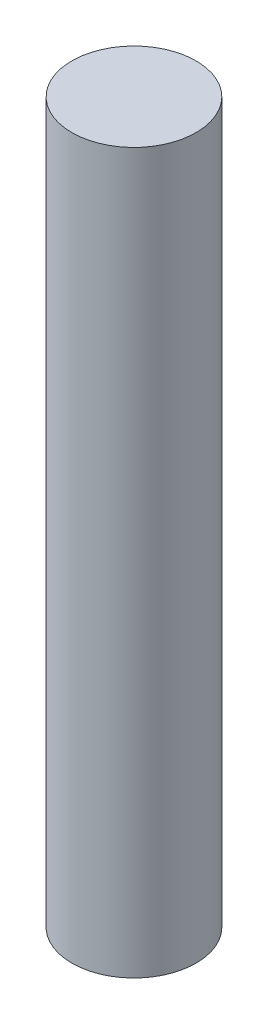
ISO-10303-21;
HEADER;
FILE_DESCRIPTION(('STEP AP214'),'2;1');
FILE_NAME('part.step','',(''),(''),'','','');
FILE_SCHEMA(('AUTOMOTIVE_DESIGN { 1 0 10303 214 1 1 1 1 }'));
ENDSEC;
DATA;
#1=APPLICATION_CONTEXT('core data for automotive mechanical design processes');
#2=APPLICATION_PROTOCOL_DEFINITION('international standard','automotive_design',2000,#1);
#3=PRODUCT_CONTEXT('',#1,'mechanical');
#4=PRODUCT('Part','Part','',(#3));
#5=PRODUCT_RELATED_PRODUCT_CATEGORY('part','',(#4));
#6=PRODUCT_DEFINITION_FORMATION('','',#4);
#7=PRODUCT_DEFINITION_CONTEXT('part definition',#1,'design');
#8=PRODUCT_DEFINITION('design','',#6,#7);
#9=PRODUCT_DEFINITION_SHAPE('','',#8);
#10=(LENGTH_UNIT() NAMED_UNIT(*) SI_UNIT(.MILLI.,.METRE.));
#11=(NAMED_UNIT(*) PLANE_ANGLE_UNIT() SI_UNIT($,.RADIAN.));
#12=(NAMED_UNIT(*) SI_UNIT($,.STERADIAN.) SOLID_ANGLE_UNIT());
#13=UNCERTAINTY_MEASURE_WITH_UNIT(LENGTH_MEASURE(1.E-05),#10,'distance_accuracy_value','');
#14=(GEOMETRIC_REPRESENTATION_CONTEXT(3) GLOBAL_UNCERTAINTY_ASSIGNED_CONTEXT((#13)) GLOBAL_UNIT_ASSIGNED_CONTEXT((#10,
#11,#12)) REPRESENTATION_CONTEXT('',''));
#15=CARTESIAN_POINT('',(0.,0.,0.));
#16=DIRECTION('',(0.,0.,1.));
#17=DIRECTION('',(1.,0.,0.));
#18=AXIS2_PLACEMENT_3D('',#15,#16,#17);
#19=CARTESIAN_POINT('',(0.,492.,0.));
#20=DIRECTION('',(0.,-1.,0.));
#21=DIRECTION('',(0.,0.,-1.));
#22=AXIS2_PLACEMENT_3D('',#19,#20,#21);
#23=CYLINDRICAL_SURFACE('',#22,42.5);
#24=CARTESIAN_POINT('',(0.,492.,0.));
#25=DIRECTION('',(0.,1.,0.));
#26=DIRECTION('',(0.,0.,1.));
#27=AXIS2_PLACEMENT_3D('',#24,#25,#26);
#28=CIRCLE('',#27,42.5);
#29=CARTESIAN_POINT('',(0.,492.,42.5));
#30=VERTEX_POINT('',#29);
#31=EDGE_CURVE('E10',#30,#30,#28,.T.);
#32=ORIENTED_EDGE('',*,*,#31,.F.);
#33=EDGE_LOOP('',(#32));
#34=FACE_BOUND('',#33,.T.);
#35=CARTESIAN_POINT('',(0.,0.,0.));
#36=DIRECTION('',(0.,1.,0.));
#37=DIRECTION('',(0.,0.,1.));
#38=AXIS2_PLACEMENT_3D('',#35,#36,#37);
#39=CIRCLE('',#38,42.5);
#40=CARTESIAN_POINT('',(0.,0.,42.5));
#41=VERTEX_POINT('',#40);
#42=EDGE_CURVE('E37',#41,#41,#39,.T.);
#43=ORIENTED_EDGE('',*,*,#42,.T.);
#44=EDGE_LOOP('',(#43));
#45=FACE_BOUND('',#44,.T.);
#46=ADVANCED_FACE('F34',(#34,#45),#23,.T.);
#47=CARTESIAN_POINT('',(0.,492.,0.));
#48=DIRECTION('',(0.,1.,0.));
#49=DIRECTION('',(0.,0.,1.));
#50=AXIS2_PLACEMENT_3D('',#47,#48,#49);
#51=PLANE('',#50);
#52=ORIENTED_EDGE('',*,*,#31,.T.);
#53=EDGE_LOOP('',(#52));
#54=FACE_BOUND('',#53,.T.);
#55=ADVANCED_FACE('F49',(#54),#51,.T.);
#56=CARTESIAN_POINT('',(0.,0.,0.));
#57=DIRECTION('',(0.,1.,0.));
#58=DIRECTION('',(0.,0.,1.));
#59=AXIS2_PLACEMENT_3D('',#56,#57,#58);
#60=PLANE('',#59);
#61=ORIENTED_EDGE('',*,*,#42,.F.);
#62=EDGE_LOOP('',(#61));
#63=FACE_BOUND('',#62,.T.);
#64=ADVANCED_FACE('F47',(#63),#60,.F.);
#65=CLOSED_SHELL('',(#46,#55,#64));
#66=MANIFOLD_SOLID_BREP('B2',#65);
#67=ADVANCED_BREP_SHAPE_REPRESENTATION('',(#18,#66),#14);
#68=SHAPE_DEFINITION_REPRESENTATION(#9,#67);
ENDSEC;
END-ISO-10303-21;
